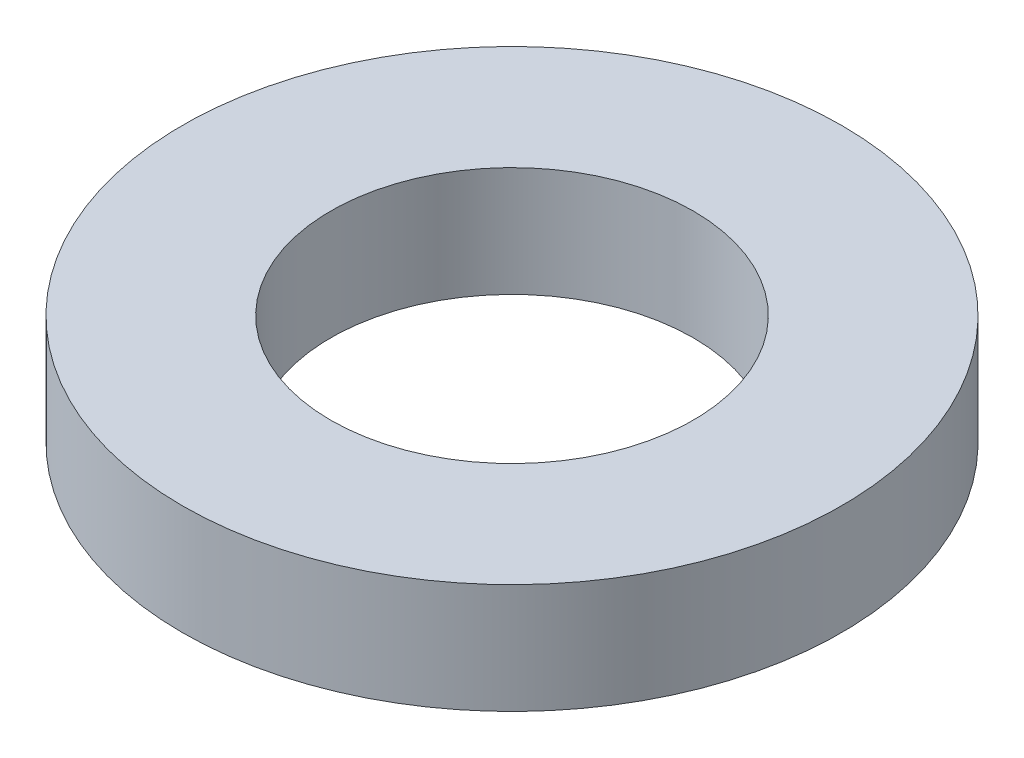
ISO-10303-21;
HEADER;
FILE_DESCRIPTION(('STEP AP214'),'2;1');
FILE_NAME('part.step','',(''),(''),'','','');
FILE_SCHEMA(('AUTOMOTIVE_DESIGN { 1 0 10303 214 1 1 1 1 }'));
ENDSEC;
DATA;
#1=APPLICATION_CONTEXT('core data for automotive mechanical design processes');
#2=APPLICATION_PROTOCOL_DEFINITION('international standard','automotive_design',2000,#1);
#3=PRODUCT_CONTEXT('',#1,'mechanical');
#4=PRODUCT('Part','Part','',(#3));
#5=PRODUCT_RELATED_PRODUCT_CATEGORY('part','',(#4));
#6=PRODUCT_DEFINITION_FORMATION('','',#4);
#7=PRODUCT_DEFINITION_CONTEXT('part definition',#1,'design');
#8=PRODUCT_DEFINITION('design','',#6,#7);
#9=PRODUCT_DEFINITION_SHAPE('','',#8);
#10=(LENGTH_UNIT() NAMED_UNIT(*) SI_UNIT(.MILLI.,.METRE.));
#11=(NAMED_UNIT(*) PLANE_ANGLE_UNIT() SI_UNIT($,.RADIAN.));
#12=(NAMED_UNIT(*) SI_UNIT($,.STERADIAN.) SOLID_ANGLE_UNIT());
#13=UNCERTAINTY_MEASURE_WITH_UNIT(LENGTH_MEASURE(1.E-05),#10,'distance_accuracy_value','');
#14=(GEOMETRIC_REPRESENTATION_CONTEXT(3) GLOBAL_UNCERTAINTY_ASSIGNED_CONTEXT((#13)) GLOBAL_UNIT_ASSIGNED_CONTEXT((#10,
#11,#12)) REPRESENTATION_CONTEXT('',''));
#15=CARTESIAN_POINT('',(0.,0.,0.));
#16=DIRECTION('',(0.,0.,1.));
#17=DIRECTION('',(1.,0.,0.));
#18=AXIS2_PLACEMENT_3D('',#15,#16,#17);
#19=CARTESIAN_POINT('',(0.,1.,0.));
#20=DIRECTION('',(0.,1.,0.));
#21=DIRECTION('',(0.,0.,1.));
#22=AXIS2_PLACEMENT_3D('',#19,#20,#21);
#23=PLANE('',#22);
#24=CARTESIAN_POINT('',(0.,1.,0.));
#25=DIRECTION('',(0.,1.,0.));
#26=DIRECTION('',(0.,0.,1.));
#27=AXIS2_PLACEMENT_3D('',#24,#25,#26);
#28=CIRCLE('',#27,3.);
#29=CARTESIAN_POINT('',(0.,1.,3.));
#30=VERTEX_POINT('',#29);
#31=EDGE_CURVE('E10',#30,#30,#28,.T.);
#32=ORIENTED_EDGE('',*,*,#31,.T.);
#33=EDGE_LOOP('',(#32));
#34=FACE_BOUND('',#33,.T.);
#35=CARTESIAN_POINT('',(0.,1.,0.));
#36=DIRECTION('',(0.,1.,0.));
#37=DIRECTION('',(0.,0.,1.));
#38=AXIS2_PLACEMENT_3D('',#35,#36,#37);
#39=CIRCLE('',#38,1.65);
#40=CARTESIAN_POINT('',(0.,1.,1.65));
#41=VERTEX_POINT('',#40);
#42=EDGE_CURVE('E52',#41,#41,#39,.T.);
#43=ORIENTED_EDGE('',*,*,#42,.F.);
#44=EDGE_LOOP('',(#43));
#45=FACE_BOUND('',#44,.T.);
#46=ADVANCED_FACE('F41',(#34,#45),#23,.T.);
#47=CARTESIAN_POINT('',(0.,0.,0.));
#48=DIRECTION('',(0.,1.,0.));
#49=DIRECTION('',(0.,0.,1.));
#50=AXIS2_PLACEMENT_3D('',#47,#48,#49);
#51=PLANE('',#50);
#52=CARTESIAN_POINT('',(0.,0.,0.));
#53=DIRECTION('',(0.,1.,0.));
#54=DIRECTION('',(0.,0.,1.));
#55=AXIS2_PLACEMENT_3D('',#52,#53,#54);
#56=CIRCLE('',#55,3.);
#57=CARTESIAN_POINT('',(0.,0.,3.));
#58=VERTEX_POINT('',#57);
#59=EDGE_CURVE('E45',#58,#58,#56,.T.);
#60=ORIENTED_EDGE('',*,*,#59,.F.);
#61=EDGE_LOOP('',(#60));
#62=FACE_BOUND('',#61,.T.);
#63=CARTESIAN_POINT('',(0.,0.,0.));
#64=DIRECTION('',(0.,1.,0.));
#65=DIRECTION('',(0.,0.,1.));
#66=AXIS2_PLACEMENT_3D('',#63,#64,#65);
#67=CIRCLE('',#66,1.65);
#68=CARTESIAN_POINT('',(0.,0.,1.65));
#69=VERTEX_POINT('',#68);
#70=EDGE_CURVE('E54',#69,#69,#67,.T.);
#71=ORIENTED_EDGE('',*,*,#70,.T.);
#72=EDGE_LOOP('',(#71));
#73=FACE_BOUND('',#72,.T.);
#74=ADVANCED_FACE('F64',(#62,#73),#51,.F.);
#75=CARTESIAN_POINT('',(0.,1.,0.));
#76=DIRECTION('',(0.,-1.,0.));
#77=DIRECTION('',(0.,0.,-1.));
#78=AXIS2_PLACEMENT_3D('',#75,#76,#77);
#79=CYLINDRICAL_SURFACE('',#78,3.);
#80=ORIENTED_EDGE('',*,*,#31,.F.);
#81=EDGE_LOOP('',(#80));
#82=FACE_BOUND('',#81,.T.);
#83=ORIENTED_EDGE('',*,*,#59,.T.);
#84=EDGE_LOOP('',(#83));
#85=FACE_BOUND('',#84,.T.);
#86=ADVANCED_FACE('F43',(#82,#85),#79,.T.);
#87=CARTESIAN_POINT('',(0.,1.,0.));
#88=DIRECTION('',(0.,-1.,0.));
#89=DIRECTION('',(0.,0.,-1.));
#90=AXIS2_PLACEMENT_3D('',#87,#88,#89);
#91=CYLINDRICAL_SURFACE('',#90,1.65);
#92=ORIENTED_EDGE('',*,*,#42,.T.);
#93=EDGE_LOOP('',(#92));
#94=FACE_BOUND('',#93,.T.);
#95=ORIENTED_EDGE('',*,*,#70,.F.);
#96=EDGE_LOOP('',(#95));
#97=FACE_BOUND('',#96,.T.);
#98=ADVANCED_FACE('F60',(#94,#97),#91,.F.);
#99=CLOSED_SHELL('',(#46,#74,#86,#98));
#100=MANIFOLD_SOLID_BREP('B2',#99);
#101=ADVANCED_BREP_SHAPE_REPRESENTATION('',(#18,#100),#14);
#102=SHAPE_DEFINITION_REPRESENTATION(#9,#101);
ENDSEC;
END-ISO-10303-21;
